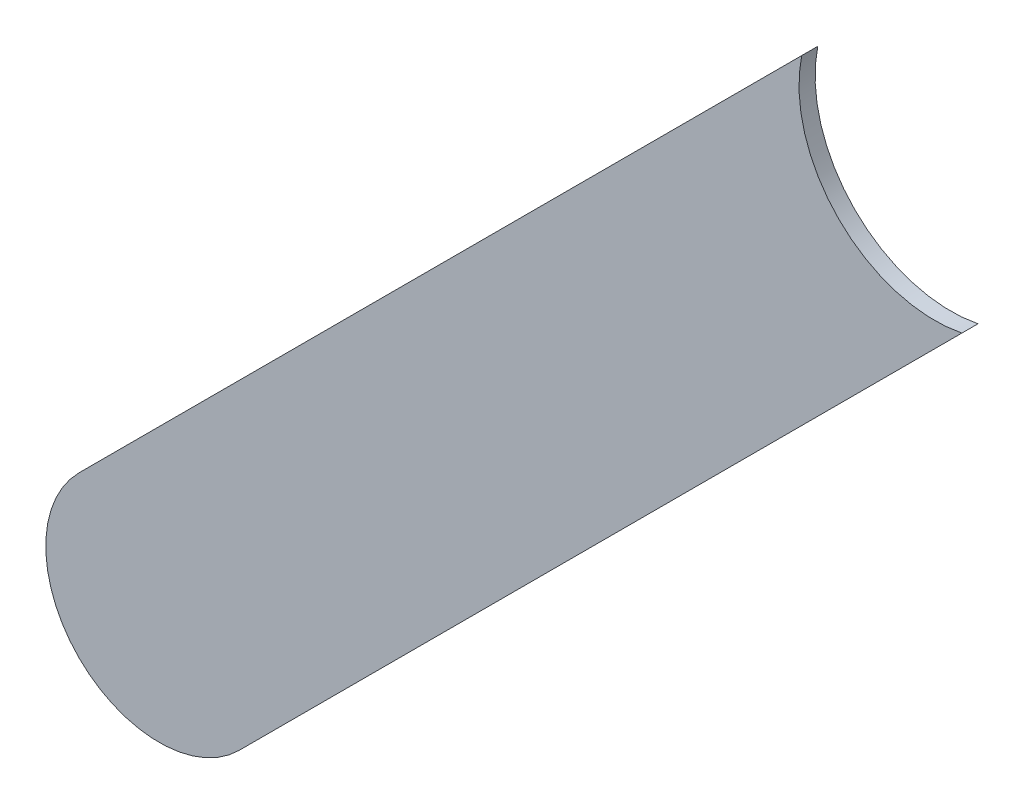
ISO-10303-21;
HEADER;
FILE_DESCRIPTION(('STEP AP214'),'2;1');
FILE_NAME('part.step','',(''),(''),'','','');
FILE_SCHEMA(('AUTOMOTIVE_DESIGN { 1 0 10303 214 1 1 1 1 }'));
ENDSEC;
DATA;
#1=APPLICATION_CONTEXT('core data for automotive mechanical design processes');
#2=APPLICATION_PROTOCOL_DEFINITION('international standard','automotive_design',2000,#1);
#3=PRODUCT_CONTEXT('',#1,'mechanical');
#4=PRODUCT('Part','Part','',(#3));
#5=PRODUCT_RELATED_PRODUCT_CATEGORY('part','',(#4));
#6=PRODUCT_DEFINITION_FORMATION('','',#4);
#7=PRODUCT_DEFINITION_CONTEXT('part definition',#1,'design');
#8=PRODUCT_DEFINITION('design','',#6,#7);
#9=PRODUCT_DEFINITION_SHAPE('','',#8);
#10=(LENGTH_UNIT() NAMED_UNIT(*) SI_UNIT(.MILLI.,.METRE.));
#11=(NAMED_UNIT(*) PLANE_ANGLE_UNIT() SI_UNIT($,.RADIAN.));
#12=(NAMED_UNIT(*) SI_UNIT($,.STERADIAN.) SOLID_ANGLE_UNIT());
#13=UNCERTAINTY_MEASURE_WITH_UNIT(LENGTH_MEASURE(1.E-05),#10,'distance_accuracy_value','');
#14=(GEOMETRIC_REPRESENTATION_CONTEXT(3) GLOBAL_UNCERTAINTY_ASSIGNED_CONTEXT((#13)) GLOBAL_UNIT_ASSIGNED_CONTEXT((#10,
#11,#12)) REPRESENTATION_CONTEXT('',''));
#15=CARTESIAN_POINT('',(0.,0.,0.));
#16=DIRECTION('',(0.,0.,1.));
#17=DIRECTION('',(1.,0.,0.));
#18=AXIS2_PLACEMENT_3D('',#15,#16,#17);
#19=CARTESIAN_POINT('',(99.86478884,101.61123442,0.));
#20=DIRECTION('',(-0.707106781186551,0.707106781186545,0.));
#21=DIRECTION('',(0.707106781186545,0.707106781186551,0.));
#22=AXIS2_PLACEMENT_3D('',#19,#20,#21);
#23=PLANE('',#22);
#24=DIRECTION('',(0.707106781186545,0.707106781186551,0.));
#25=VECTOR('',#24,1.);
#26=CARTESIAN_POINT('',(99.86478884,101.61123442,0.03556));
#27=LINE('',#26,#25);
#28=CARTESIAN_POINT('',(99.86478884,101.61123442,0.03556));
#29=VERTEX_POINT('',#28);
#30=CARTESIAN_POINT('',(101.459536998199,103.2059825782,0.03556));
#31=VERTEX_POINT('',#30);
#32=EDGE_CURVE('E11',#29,#31,#27,.T.);
#33=ORIENTED_EDGE('',*,*,#32,.F.);
#34=DIRECTION('',(0.,0.,1.));
#35=VECTOR('',#34,1.);
#36=CARTESIAN_POINT('',(99.86478884,101.61123442,0.));
#37=LINE('',#36,#35);
#38=CARTESIAN_POINT('',(99.86478884,101.61123442,0.));
#39=VERTEX_POINT('',#38);
#40=EDGE_CURVE('E24',#39,#29,#37,.T.);
#41=ORIENTED_EDGE('',*,*,#40,.F.);
#42=DIRECTION('',(0.707106781186545,0.707106781186551,0.));
#43=VECTOR('',#42,1.);
#44=CARTESIAN_POINT('',(99.86478884,101.61123442,0.));
#45=LINE('',#44,#43);
#46=CARTESIAN_POINT('',(101.459536998199,103.2059825782,0.));
#47=VERTEX_POINT('',#46);
#48=EDGE_CURVE('E75',#39,#47,#45,.T.);
#49=ORIENTED_EDGE('',*,*,#48,.T.);
#50=DIRECTION('',(0.,0.,1.));
#51=VECTOR('',#50,1.);
#52=CARTESIAN_POINT('',(101.459536998199,103.2059825782,0.));
#53=LINE('',#52,#51);
#54=EDGE_CURVE('E37',#47,#31,#53,.T.);
#55=ORIENTED_EDGE('',*,*,#54,.T.);
#56=EDGE_LOOP('',(#33,#41,#49,#55));
#57=FACE_BOUND('',#56,.T.);
#58=ADVANCED_FACE('F17',(#57),#23,.F.);
#59=CARTESIAN_POINT('',(101.40002072,103.50001906,0.));
#60=DIRECTION('',(0.,0.,-1.));
#61=DIRECTION('',(1.,0.,0.));
#62=AXIS2_PLACEMENT_3D('',#59,#60,#61);
#63=CYLINDRICAL_SURFACE('',#62,0.2999994);
#64=DIRECTION('',(0.,0.,1.));
#65=VECTOR('',#64,1.);
#66=CARTESIAN_POINT('',(101.105984238199,103.5595353382,0.));
#67=LINE('',#66,#65);
#68=CARTESIAN_POINT('',(101.105984238199,103.5595353382,0.));
#69=VERTEX_POINT('',#68);
#70=CARTESIAN_POINT('',(101.105984238199,103.5595353382,0.03556));
#71=VERTEX_POINT('',#70);
#72=EDGE_CURVE('E67',#69,#71,#67,.T.);
#73=ORIENTED_EDGE('',*,*,#72,.T.);
#74=CARTESIAN_POINT('',(101.40002072,103.50001906,0.03556));
#75=DIRECTION('',(0.,0.,1.));
#76=DIRECTION('',(1.,0.,0.));
#77=AXIS2_PLACEMENT_3D('',#74,#75,#76);
#78=CIRCLE('',#77,0.2999994);
#79=EDGE_CURVE('E82',#71,#31,#78,.T.);
#80=ORIENTED_EDGE('',*,*,#79,.T.);
#81=ORIENTED_EDGE('',*,*,#54,.F.);
#82=CARTESIAN_POINT('',(101.40002072,103.50001906,0.));
#83=DIRECTION('',(0.,0.,1.));
#84=DIRECTION('',(1.,0.,0.));
#85=AXIS2_PLACEMENT_3D('',#82,#83,#84);
#86=CIRCLE('',#85,0.2999994);
#87=EDGE_CURVE('E80',#69,#47,#86,.T.);
#88=ORIENTED_EDGE('',*,*,#87,.F.);
#89=EDGE_LOOP('',(#73,#80,#81,#88));
#90=FACE_BOUND('',#89,.T.);
#91=ADVANCED_FACE('F88',(#90),#63,.F.);
#92=CARTESIAN_POINT('',(101.105984238199,103.5595353382,0.));
#93=DIRECTION('',(0.707106781186545,-0.707106781186551,0.));
#94=DIRECTION('',(-0.707106781186551,-0.707106781186545,0.));
#95=AXIS2_PLACEMENT_3D('',#92,#93,#94);
#96=PLANE('',#95);
#97=DIRECTION('',(-0.707106781186551,-0.707106781186545,0.));
#98=VECTOR('',#97,1.);
#99=CARTESIAN_POINT('',(101.22324434,103.67679544,0.03556));
#100=LINE('',#99,#98);
#101=CARTESIAN_POINT('',(99.51123608,101.96478718,0.03556));
#102=VERTEX_POINT('',#101);
#103=EDGE_CURVE('E71',#71,#102,#100,.T.);
#104=ORIENTED_EDGE('',*,*,#103,.F.);
#105=ORIENTED_EDGE('',*,*,#72,.F.);
#106=DIRECTION('',(-0.707106781186551,-0.707106781186545,0.));
#107=VECTOR('',#106,1.);
#108=CARTESIAN_POINT('',(101.22324434,103.67679544,0.));
#109=LINE('',#108,#107);
#110=CARTESIAN_POINT('',(99.51123608,101.96478718,0.));
#111=VERTEX_POINT('',#110);
#112=EDGE_CURVE('E63',#69,#111,#109,.T.);
#113=ORIENTED_EDGE('',*,*,#112,.T.);
#114=DIRECTION('',(0.,0.,1.));
#115=VECTOR('',#114,1.);
#116=CARTESIAN_POINT('',(99.51123608,101.96478718,0.));
#117=LINE('',#116,#115);
#118=EDGE_CURVE('E53',#111,#102,#117,.T.);
#119=ORIENTED_EDGE('',*,*,#118,.T.);
#120=EDGE_LOOP('',(#104,#105,#113,#119));
#121=FACE_BOUND('',#120,.T.);
#122=ADVANCED_FACE('F66',(#121),#96,.F.);
#123=CARTESIAN_POINT('',(99.68801246,101.7880108,0.));
#124=DIRECTION('',(0.,0.,-1.));
#125=DIRECTION('',(-0.707106781186519,0.707106781186576,0.));
#126=AXIS2_PLACEMENT_3D('',#123,#124,#125);
#127=CYLINDRICAL_SURFACE('',#126,0.249999554103223);
#128=CARTESIAN_POINT('',(99.68801246,101.7880108,0.03556));
#129=DIRECTION('',(0.,0.,1.));
#130=DIRECTION('',(-0.707106781186519,0.707106781186576,0.));
#131=AXIS2_PLACEMENT_3D('',#128,#129,#130);
#132=CIRCLE('',#131,0.249999554103223);
#133=EDGE_CURVE('E59',#102,#29,#132,.T.);
#134=ORIENTED_EDGE('',*,*,#133,.F.);
#135=ORIENTED_EDGE('',*,*,#118,.F.);
#136=CARTESIAN_POINT('',(99.68801246,101.7880108,0.));
#137=DIRECTION('',(0.,0.,1.));
#138=DIRECTION('',(-0.707106781186519,0.707106781186576,0.));
#139=AXIS2_PLACEMENT_3D('',#136,#137,#138);
#140=CIRCLE('',#139,0.249999554103223);
#141=EDGE_CURVE('E57',#111,#39,#140,.T.);
#142=ORIENTED_EDGE('',*,*,#141,.T.);
#143=ORIENTED_EDGE('',*,*,#40,.T.);
#144=EDGE_LOOP('',(#134,#135,#142,#143));
#145=FACE_BOUND('',#144,.T.);
#146=ADVANCED_FACE('F55',(#145),#127,.T.);
#147=CARTESIAN_POINT('',(99.86478884,101.61123442,0.));
#148=DIRECTION('',(0.,0.,-1.));
#149=DIRECTION('',(-1.,0.,0.));
#150=AXIS2_PLACEMENT_3D('',#147,#148,#149);
#151=PLANE('',#150);
#152=ORIENTED_EDGE('',*,*,#48,.F.);
#153=ORIENTED_EDGE('',*,*,#141,.F.);
#154=ORIENTED_EDGE('',*,*,#112,.F.);
#155=ORIENTED_EDGE('',*,*,#87,.T.);
#156=EDGE_LOOP('',(#152,#153,#154,#155));
#157=FACE_BOUND('',#156,.T.);
#158=ADVANCED_FACE('F74',(#157),#151,.T.);
#159=CARTESIAN_POINT('',(99.86478884,101.61123442,0.03556));
#160=DIRECTION('',(0.,0.,-1.));
#161=DIRECTION('',(-1.,0.,0.));
#162=AXIS2_PLACEMENT_3D('',#159,#160,#161);
#163=PLANE('',#162);
#164=ORIENTED_EDGE('',*,*,#133,.T.);
#165=ORIENTED_EDGE('',*,*,#32,.T.);
#166=ORIENTED_EDGE('',*,*,#79,.F.);
#167=ORIENTED_EDGE('',*,*,#103,.T.);
#168=EDGE_LOOP('',(#164,#165,#166,#167));
#169=FACE_BOUND('',#168,.T.);
#170=ADVANCED_FACE('F91',(#169),#163,.F.);
#171=CLOSED_SHELL('',(#58,#91,#122,#146,#158,#170));
#172=MANIFOLD_SOLID_BREP('B1',#171);
#173=ADVANCED_BREP_SHAPE_REPRESENTATION('',(#18,#172),#14);
#174=SHAPE_DEFINITION_REPRESENTATION(#9,#173);
ENDSEC;
END-ISO-10303-21;
